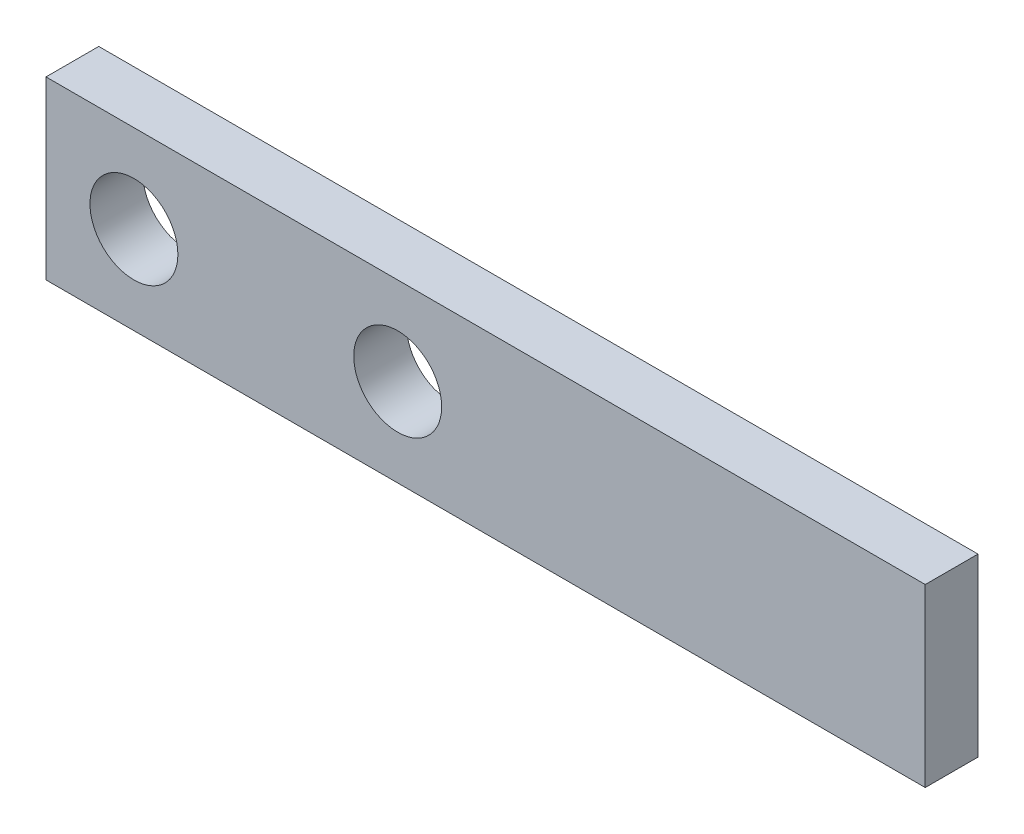
ISO-10303-21;
HEADER;
FILE_DESCRIPTION(('STEP AP214'),'2;1');
FILE_NAME('part.step','',(''),(''),'','','');
FILE_SCHEMA(('AUTOMOTIVE_DESIGN { 1 0 10303 214 1 1 1 1 }'));
ENDSEC;
DATA;
#1=APPLICATION_CONTEXT('core data for automotive mechanical design processes');
#2=APPLICATION_PROTOCOL_DEFINITION('international standard','automotive_design',2000,#1);
#3=PRODUCT_CONTEXT('',#1,'mechanical');
#4=PRODUCT('Part','Part','',(#3));
#5=PRODUCT_RELATED_PRODUCT_CATEGORY('part','',(#4));
#6=PRODUCT_DEFINITION_FORMATION('','',#4);
#7=PRODUCT_DEFINITION_CONTEXT('part definition',#1,'design');
#8=PRODUCT_DEFINITION('design','',#6,#7);
#9=PRODUCT_DEFINITION_SHAPE('','',#8);
#10=(LENGTH_UNIT() NAMED_UNIT(*) SI_UNIT(.MILLI.,.METRE.));
#11=(NAMED_UNIT(*) PLANE_ANGLE_UNIT() SI_UNIT($,.RADIAN.));
#12=(NAMED_UNIT(*) SI_UNIT($,.STERADIAN.) SOLID_ANGLE_UNIT());
#13=UNCERTAINTY_MEASURE_WITH_UNIT(LENGTH_MEASURE(1.E-05),#10,'distance_accuracy_value','');
#14=(GEOMETRIC_REPRESENTATION_CONTEXT(3) GLOBAL_UNCERTAINTY_ASSIGNED_CONTEXT((#13)) GLOBAL_UNIT_ASSIGNED_CONTEXT((#10,
#11,#12)) REPRESENTATION_CONTEXT('',''));
#15=CARTESIAN_POINT('',(0.,0.,0.));
#16=DIRECTION('',(0.,0.,1.));
#17=DIRECTION('',(1.,0.,0.));
#18=AXIS2_PLACEMENT_3D('',#15,#16,#17);
#19=CARTESIAN_POINT('',(0.,0.,3.));
#20=DIRECTION('',(0.,0.,-1.));
#21=DIRECTION('',(-1.,0.,0.));
#22=AXIS2_PLACEMENT_3D('',#19,#20,#21);
#23=PLANE('',#22);
#24=DIRECTION('',(0.,1.,0.));
#25=VECTOR('',#24,1.);
#26=CARTESIAN_POINT('',(25.,-5.,3.));
#27=LINE('',#26,#25);
#28=CARTESIAN_POINT('',(25.,-5.,3.));
#29=VERTEX_POINT('',#28);
#30=CARTESIAN_POINT('',(25.,5.,3.));
#31=VERTEX_POINT('',#30);
#32=EDGE_CURVE('E85',#29,#31,#27,.T.);
#33=ORIENTED_EDGE('',*,*,#32,.T.);
#34=DIRECTION('',(-1.,0.,0.));
#35=VECTOR('',#34,1.);
#36=CARTESIAN_POINT('',(-25.,5.,3.));
#37=LINE('',#36,#35);
#38=CARTESIAN_POINT('',(-25.,5.,3.));
#39=VERTEX_POINT('',#38);
#40=EDGE_CURVE('E80',#31,#39,#37,.T.);
#41=ORIENTED_EDGE('',*,*,#40,.T.);
#42=DIRECTION('',(0.,-1.,0.));
#43=VECTOR('',#42,1.);
#44=CARTESIAN_POINT('',(-25.,-5.,3.));
#45=LINE('',#44,#43);
#46=CARTESIAN_POINT('',(-25.,-5.,3.));
#47=VERTEX_POINT('',#46);
#48=EDGE_CURVE('E83',#39,#47,#45,.T.);
#49=ORIENTED_EDGE('',*,*,#48,.T.);
#50=DIRECTION('',(1.,0.,0.));
#51=VECTOR('',#50,1.);
#52=CARTESIAN_POINT('',(-25.,-5.,3.));
#53=LINE('',#52,#51);
#54=EDGE_CURVE('E50',#47,#29,#53,.T.);
#55=ORIENTED_EDGE('',*,*,#54,.T.);
#56=EDGE_LOOP('',(#33,#41,#49,#55));
#57=FACE_BOUND('',#56,.T.);
#58=CARTESIAN_POINT('',(-20.,0.,3.));
#59=DIRECTION('',(0.,0.,1.));
#60=DIRECTION('',(1.,0.,0.));
#61=AXIS2_PLACEMENT_3D('',#58,#59,#60);
#62=CIRCLE('',#61,2.5);
#63=CARTESIAN_POINT('',(-17.5,0.,3.));
#64=VERTEX_POINT('',#63);
#65=EDGE_CURVE('E100',#64,#64,#62,.T.);
#66=ORIENTED_EDGE('',*,*,#65,.F.);
#67=EDGE_LOOP('',(#66));
#68=FACE_BOUND('',#67,.T.);
#69=CARTESIAN_POINT('',(-5.00000000000001,0.,3.));
#70=DIRECTION('',(0.,0.,1.));
#71=DIRECTION('',(1.,0.,0.));
#72=AXIS2_PLACEMENT_3D('',#69,#70,#71);
#73=CIRCLE('',#72,2.5);
#74=CARTESIAN_POINT('',(-2.50000000000001,0.,3.));
#75=VERTEX_POINT('',#74);
#76=EDGE_CURVE('E115',#75,#75,#73,.T.);
#77=ORIENTED_EDGE('',*,*,#76,.F.);
#78=EDGE_LOOP('',(#77));
#79=FACE_BOUND('',#78,.T.);
#80=ADVANCED_FACE('F33',(#57,#68,#79),#23,.F.);
#81=CARTESIAN_POINT('',(0.,0.,0.));
#82=DIRECTION('',(0.,0.,-1.));
#83=DIRECTION('',(-1.,0.,0.));
#84=AXIS2_PLACEMENT_3D('',#81,#82,#83);
#85=PLANE('',#84);
#86=CARTESIAN_POINT('',(-20.,0.,0.));
#87=DIRECTION('',(0.,0.,1.));
#88=DIRECTION('',(1.,0.,0.));
#89=AXIS2_PLACEMENT_3D('',#86,#87,#88);
#90=CIRCLE('',#89,2.5);
#91=CARTESIAN_POINT('',(-17.5,0.,0.));
#92=VERTEX_POINT('',#91);
#93=EDGE_CURVE('E112',#92,#92,#90,.T.);
#94=ORIENTED_EDGE('',*,*,#93,.T.);
#95=EDGE_LOOP('',(#94));
#96=FACE_BOUND('',#95,.T.);
#97=DIRECTION('',(0.,1.,0.));
#98=VECTOR('',#97,1.);
#99=CARTESIAN_POINT('',(25.,-5.,0.));
#100=LINE('',#99,#98);
#101=CARTESIAN_POINT('',(25.,-5.,0.));
#102=VERTEX_POINT('',#101);
#103=CARTESIAN_POINT('',(25.,5.,0.));
#104=VERTEX_POINT('',#103);
#105=EDGE_CURVE('E97',#102,#104,#100,.T.);
#106=ORIENTED_EDGE('',*,*,#105,.F.);
#107=DIRECTION('',(1.,0.,0.));
#108=VECTOR('',#107,1.);
#109=CARTESIAN_POINT('',(-25.,-5.,0.));
#110=LINE('',#109,#108);
#111=CARTESIAN_POINT('',(-25.,-5.,0.));
#112=VERTEX_POINT('',#111);
#113=EDGE_CURVE('E73',#112,#102,#110,.T.);
#114=ORIENTED_EDGE('',*,*,#113,.F.);
#115=DIRECTION('',(0.,-1.,0.));
#116=VECTOR('',#115,1.);
#117=CARTESIAN_POINT('',(-25.,-5.,0.));
#118=LINE('',#117,#116);
#119=CARTESIAN_POINT('',(-25.,5.,0.));
#120=VERTEX_POINT('',#119);
#121=EDGE_CURVE('E67',#120,#112,#118,.T.);
#122=ORIENTED_EDGE('',*,*,#121,.F.);
#123=DIRECTION('',(-1.,0.,0.));
#124=VECTOR('',#123,1.);
#125=CARTESIAN_POINT('',(-25.,5.,0.));
#126=LINE('',#125,#124);
#127=EDGE_CURVE('E89',#104,#120,#126,.T.);
#128=ORIENTED_EDGE('',*,*,#127,.F.);
#129=EDGE_LOOP('',(#106,#114,#122,#128));
#130=FACE_BOUND('',#129,.T.);
#131=CARTESIAN_POINT('',(-5.00000000000001,0.,0.));
#132=DIRECTION('',(0.,0.,1.));
#133=DIRECTION('',(1.,0.,0.));
#134=AXIS2_PLACEMENT_3D('',#131,#132,#133);
#135=CIRCLE('',#134,2.5);
#136=CARTESIAN_POINT('',(-2.50000000000001,0.,0.));
#137=VERTEX_POINT('',#136);
#138=EDGE_CURVE('E118',#137,#137,#135,.T.);
#139=ORIENTED_EDGE('',*,*,#138,.T.);
#140=EDGE_LOOP('',(#139));
#141=FACE_BOUND('',#140,.T.);
#142=ADVANCED_FACE('F108',(#96,#130,#141),#85,.T.);
#143=CARTESIAN_POINT('',(25.,-5.,3.));
#144=DIRECTION('',(-1.,0.,0.));
#145=DIRECTION('',(0.,0.,1.));
#146=AXIS2_PLACEMENT_3D('',#143,#144,#145);
#147=PLANE('',#146);
#148=ORIENTED_EDGE('',*,*,#105,.T.);
#149=DIRECTION('',(0.,0.,-1.));
#150=VECTOR('',#149,1.);
#151=CARTESIAN_POINT('',(25.,5.,3.));
#152=LINE('',#151,#150);
#153=EDGE_CURVE('E11',#31,#104,#152,.T.);
#154=ORIENTED_EDGE('',*,*,#153,.F.);
#155=ORIENTED_EDGE('',*,*,#32,.F.);
#156=DIRECTION('',(0.,0.,-1.));
#157=VECTOR('',#156,1.);
#158=CARTESIAN_POINT('',(25.,-5.,3.));
#159=LINE('',#158,#157);
#160=EDGE_CURVE('E93',#29,#102,#159,.T.);
#161=ORIENTED_EDGE('',*,*,#160,.T.);
#162=EDGE_LOOP('',(#148,#154,#155,#161));
#163=FACE_BOUND('',#162,.T.);
#164=ADVANCED_FACE('F35',(#163),#147,.F.);
#165=CARTESIAN_POINT('',(-25.,5.,3.));
#166=DIRECTION('',(0.,-1.,0.));
#167=DIRECTION('',(0.,0.,-1.));
#168=AXIS2_PLACEMENT_3D('',#165,#166,#167);
#169=PLANE('',#168);
#170=ORIENTED_EDGE('',*,*,#127,.T.);
#171=DIRECTION('',(0.,0.,-1.));
#172=VECTOR('',#171,1.);
#173=CARTESIAN_POINT('',(-25.,5.,3.));
#174=LINE('',#173,#172);
#175=EDGE_CURVE('E42',#39,#120,#174,.T.);
#176=ORIENTED_EDGE('',*,*,#175,.F.);
#177=ORIENTED_EDGE('',*,*,#40,.F.);
#178=ORIENTED_EDGE('',*,*,#153,.T.);
#179=EDGE_LOOP('',(#170,#176,#177,#178));
#180=FACE_BOUND('',#179,.T.);
#181=ADVANCED_FACE('F88',(#180),#169,.F.);
#182=CARTESIAN_POINT('',(-25.,-5.,3.));
#183=DIRECTION('',(1.,0.,0.));
#184=DIRECTION('',(0.,0.,-1.));
#185=AXIS2_PLACEMENT_3D('',#182,#183,#184);
#186=PLANE('',#185);
#187=ORIENTED_EDGE('',*,*,#121,.T.);
#188=DIRECTION('',(0.,0.,-1.));
#189=VECTOR('',#188,1.);
#190=CARTESIAN_POINT('',(-25.,-5.,3.));
#191=LINE('',#190,#189);
#192=EDGE_CURVE('E90',#47,#112,#191,.T.);
#193=ORIENTED_EDGE('',*,*,#192,.F.);
#194=ORIENTED_EDGE('',*,*,#48,.F.);
#195=ORIENTED_EDGE('',*,*,#175,.T.);
#196=EDGE_LOOP('',(#187,#193,#194,#195));
#197=FACE_BOUND('',#196,.T.);
#198=ADVANCED_FACE('F91',(#197),#186,.F.);
#199=CARTESIAN_POINT('',(-25.,-5.,3.));
#200=DIRECTION('',(0.,1.,0.));
#201=DIRECTION('',(0.,0.,1.));
#202=AXIS2_PLACEMENT_3D('',#199,#200,#201);
#203=PLANE('',#202);
#204=ORIENTED_EDGE('',*,*,#113,.T.);
#205=ORIENTED_EDGE('',*,*,#160,.F.);
#206=ORIENTED_EDGE('',*,*,#54,.F.);
#207=ORIENTED_EDGE('',*,*,#192,.T.);
#208=EDGE_LOOP('',(#204,#205,#206,#207));
#209=FACE_BOUND('',#208,.T.);
#210=ADVANCED_FACE('F105',(#209),#203,.F.);
#211=CARTESIAN_POINT('',(-20.,0.,3.));
#212=DIRECTION('',(0.,0.,-1.));
#213=DIRECTION('',(-1.,0.,0.));
#214=AXIS2_PLACEMENT_3D('',#211,#212,#213);
#215=CYLINDRICAL_SURFACE('',#214,2.5);
#216=ORIENTED_EDGE('',*,*,#65,.T.);
#217=EDGE_LOOP('',(#216));
#218=FACE_BOUND('',#217,.T.);
#219=ORIENTED_EDGE('',*,*,#93,.F.);
#220=EDGE_LOOP('',(#219));
#221=FACE_BOUND('',#220,.T.);
#222=ADVANCED_FACE('F135',(#218,#221),#215,.F.);
#223=CARTESIAN_POINT('',(-5.00000000000001,0.,3.));
#224=DIRECTION('',(0.,0.,-1.));
#225=DIRECTION('',(-1.,0.,0.));
#226=AXIS2_PLACEMENT_3D('',#223,#224,#225);
#227=CYLINDRICAL_SURFACE('',#226,2.5);
#228=ORIENTED_EDGE('',*,*,#76,.T.);
#229=EDGE_LOOP('',(#228));
#230=FACE_BOUND('',#229,.T.);
#231=ORIENTED_EDGE('',*,*,#138,.F.);
#232=EDGE_LOOP('',(#231));
#233=FACE_BOUND('',#232,.T.);
#234=ADVANCED_FACE('F124',(#230,#233),#227,.F.);
#235=CLOSED_SHELL('',(#80,#142,#164,#181,#198,#210,#222,#234));
#236=MANIFOLD_SOLID_BREP('B2',#235);
#237=ADVANCED_BREP_SHAPE_REPRESENTATION('',(#18,#236),#14);
#238=SHAPE_DEFINITION_REPRESENTATION(#9,#237);
ENDSEC;
END-ISO-10303-21;
